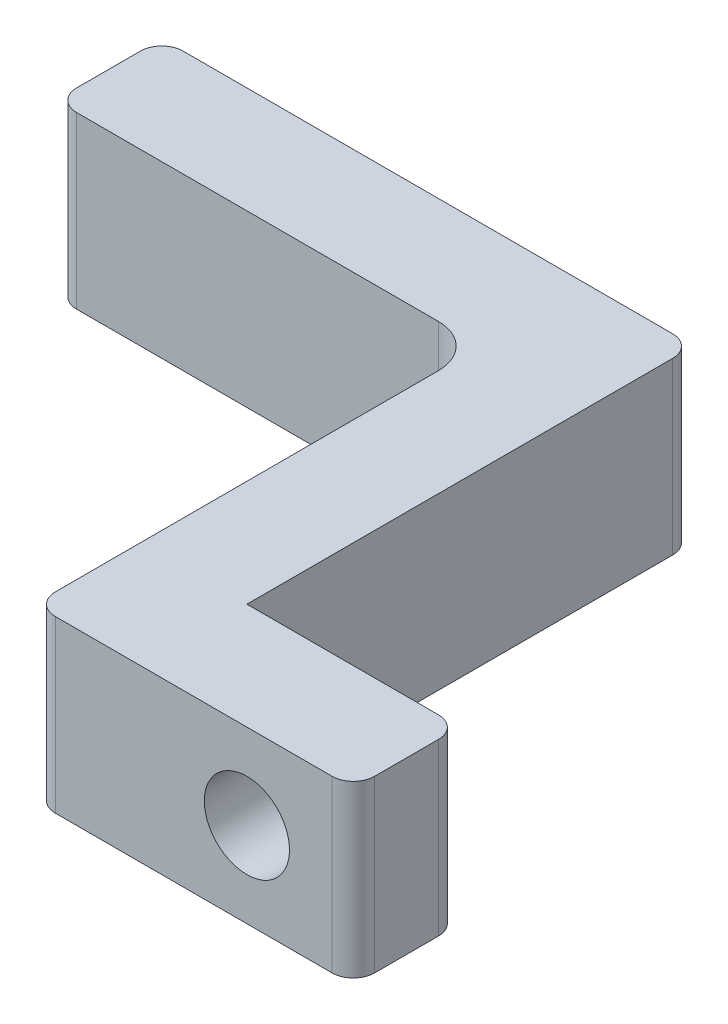
ISO-10303-21;
HEADER;
FILE_DESCRIPTION(('STEP AP214'),'2;1');
FILE_NAME('part.step','',(''),(''),'','','');
FILE_SCHEMA(('AUTOMOTIVE_DESIGN { 1 0 10303 214 1 1 1 1 }'));
ENDSEC;
DATA;
#1=APPLICATION_CONTEXT('core data for automotive mechanical design processes');
#2=APPLICATION_PROTOCOL_DEFINITION('international standard','automotive_design',2000,#1);
#3=PRODUCT_CONTEXT('',#1,'mechanical');
#4=PRODUCT('Part','Part','',(#3));
#5=PRODUCT_RELATED_PRODUCT_CATEGORY('part','',(#4));
#6=PRODUCT_DEFINITION_FORMATION('','',#4);
#7=PRODUCT_DEFINITION_CONTEXT('part definition',#1,'design');
#8=PRODUCT_DEFINITION('design','',#6,#7);
#9=PRODUCT_DEFINITION_SHAPE('','',#8);
#10=(LENGTH_UNIT() NAMED_UNIT(*) SI_UNIT(.MILLI.,.METRE.));
#11=(NAMED_UNIT(*) PLANE_ANGLE_UNIT() SI_UNIT($,.RADIAN.));
#12=(NAMED_UNIT(*) SI_UNIT($,.STERADIAN.) SOLID_ANGLE_UNIT());
#13=UNCERTAINTY_MEASURE_WITH_UNIT(LENGTH_MEASURE(1.E-05),#10,'distance_accuracy_value','');
#14=(GEOMETRIC_REPRESENTATION_CONTEXT(3) GLOBAL_UNCERTAINTY_ASSIGNED_CONTEXT((#13)) GLOBAL_UNIT_ASSIGNED_CONTEXT((#10,
#11,#12)) REPRESENTATION_CONTEXT('',''));
#15=CARTESIAN_POINT('',(0.,0.,0.));
#16=DIRECTION('',(0.,0.,1.));
#17=DIRECTION('',(1.,0.,0.));
#18=AXIS2_PLACEMENT_3D('',#15,#16,#17);
#19=CARTESIAN_POINT('',(0.,8.,0.));
#20=DIRECTION('',(0.,0.,1.));
#21=DIRECTION('',(1.,0.,0.));
#22=AXIS2_PLACEMENT_3D('',#19,#20,#21);
#23=PLANE('',#22);
#24=DIRECTION('',(-1.,0.,0.));
#25=VECTOR('',#24,1.);
#26=CARTESIAN_POINT('',(0.,8.,0.));
#27=LINE('',#26,#25);
#28=CARTESIAN_POINT('',(-2.,8.,0.));
#29=VERTEX_POINT('',#28);
#30=CARTESIAN_POINT('',(-19.,8.,0.));
#31=VERTEX_POINT('',#30);
#32=EDGE_CURVE('E155',#29,#31,#27,.T.);
#33=ORIENTED_EDGE('',*,*,#32,.T.);
#34=DIRECTION('',(0.,-1.,0.));
#35=VECTOR('',#34,1.);
#36=CARTESIAN_POINT('',(-19.,8.,0.));
#37=LINE('',#36,#35);
#38=CARTESIAN_POINT('',(-19.,0.,0.));
#39=VERTEX_POINT('',#38);
#40=EDGE_CURVE('E256',#31,#39,#37,.T.);
#41=ORIENTED_EDGE('',*,*,#40,.T.);
#42=DIRECTION('',(-1.,0.,0.));
#43=VECTOR('',#42,1.);
#44=CARTESIAN_POINT('',(0.,0.,0.));
#45=LINE('',#44,#43);
#46=CARTESIAN_POINT('',(-2.,0.,0.));
#47=VERTEX_POINT('',#46);
#48=EDGE_CURVE('E158',#47,#39,#45,.T.);
#49=ORIENTED_EDGE('',*,*,#48,.F.);
#50=DIRECTION('',(0.,-1.,0.));
#51=VECTOR('',#50,1.);
#52=CARTESIAN_POINT('',(-2.,8.,0.));
#53=LINE('',#52,#51);
#54=EDGE_CURVE('E151',#29,#47,#53,.T.);
#55=ORIENTED_EDGE('',*,*,#54,.F.);
#56=EDGE_LOOP('',(#33,#41,#49,#55));
#57=FACE_BOUND('',#56,.T.);
#58=ADVANCED_FACE('F43',(#57),#23,.T.);
#59=CARTESIAN_POINT('',(-2.,8.,2.));
#60=DIRECTION('',(0.,-1.,0.));
#61=DIRECTION('',(0.,0.,-1.));
#62=AXIS2_PLACEMENT_3D('',#59,#60,#61);
#63=CYLINDRICAL_SURFACE('',#62,2.);
#64=CARTESIAN_POINT('',(-2.,0.,2.));
#65=DIRECTION('',(0.,1.,0.));
#66=DIRECTION('',(0.,0.,1.));
#67=AXIS2_PLACEMENT_3D('',#64,#65,#66);
#68=CIRCLE('',#67,2.);
#69=CARTESIAN_POINT('',(0.,0.,2.));
#70=VERTEX_POINT('',#69);
#71=EDGE_CURVE('E203',#47,#70,#68,.F.);
#72=ORIENTED_EDGE('',*,*,#71,.T.);
#73=DIRECTION('',(0.,-1.,0.));
#74=VECTOR('',#73,1.);
#75=CARTESIAN_POINT('',(0.,8.,2.));
#76=LINE('',#75,#74);
#77=CARTESIAN_POINT('',(0.,8.,2.));
#78=VERTEX_POINT('',#77);
#79=EDGE_CURVE('E162',#78,#70,#76,.T.);
#80=ORIENTED_EDGE('',*,*,#79,.F.);
#81=CARTESIAN_POINT('',(-2.,8.,2.));
#82=DIRECTION('',(0.,1.,0.));
#83=DIRECTION('',(0.,0.,1.));
#84=AXIS2_PLACEMENT_3D('',#81,#82,#83);
#85=CIRCLE('',#84,2.);
#86=EDGE_CURVE('E165',#29,#78,#85,.F.);
#87=ORIENTED_EDGE('',*,*,#86,.F.);
#88=ORIENTED_EDGE('',*,*,#54,.T.);
#89=EDGE_LOOP('',(#72,#80,#87,#88));
#90=FACE_BOUND('',#89,.T.);
#91=ADVANCED_FACE('F166',(#90),#63,.F.);
#92=CARTESIAN_POINT('',(0.,8.,0.));
#93=DIRECTION('',(1.,0.,0.));
#94=DIRECTION('',(0.,0.,-1.));
#95=AXIS2_PLACEMENT_3D('',#92,#93,#94);
#96=PLANE('',#95);
#97=DIRECTION('',(0.,0.,1.));
#98=VECTOR('',#97,1.);
#99=CARTESIAN_POINT('',(0.,0.,0.));
#100=LINE('',#99,#98);
#101=CARTESIAN_POINT('',(0.,0.,20.));
#102=VERTEX_POINT('',#101);
#103=EDGE_CURVE('E206',#70,#102,#100,.T.);
#104=ORIENTED_EDGE('',*,*,#103,.T.);
#105=DIRECTION('',(0.,-1.,0.));
#106=VECTOR('',#105,1.);
#107=CARTESIAN_POINT('',(0.,8.,20.));
#108=LINE('',#107,#106);
#109=CARTESIAN_POINT('',(0.,8.,20.));
#110=VERTEX_POINT('',#109);
#111=EDGE_CURVE('E263',#102,#110,#108,.F.);
#112=ORIENTED_EDGE('',*,*,#111,.T.);
#113=DIRECTION('',(0.,0.,1.));
#114=VECTOR('',#113,1.);
#115=CARTESIAN_POINT('',(0.,8.,0.));
#116=LINE('',#115,#114);
#117=EDGE_CURVE('E170',#78,#110,#116,.T.);
#118=ORIENTED_EDGE('',*,*,#117,.F.);
#119=ORIENTED_EDGE('',*,*,#79,.T.);
#120=EDGE_LOOP('',(#104,#112,#118,#119));
#121=FACE_BOUND('',#120,.T.);
#122=ADVANCED_FACE('F300',(#121),#96,.F.);
#123=CARTESIAN_POINT('',(0.,8.,21.));
#124=DIRECTION('',(0.,0.,-1.));
#125=DIRECTION('',(-1.,0.,0.));
#126=AXIS2_PLACEMENT_3D('',#123,#124,#125);
#127=PLANE('',#126);
#128=CARTESIAN_POINT('',(10.,4.,21.));
#129=DIRECTION('',(0.,0.,-1.));
#130=DIRECTION('',(-1.,0.,0.));
#131=AXIS2_PLACEMENT_3D('',#128,#129,#130);
#132=CIRCLE('',#131,2.);
#133=CARTESIAN_POINT('',(8.,4.,21.));
#134=VERTEX_POINT('',#133);
#135=EDGE_CURVE('E204',#134,#134,#132,.T.);
#136=ORIENTED_EDGE('',*,*,#135,.T.);
#137=EDGE_LOOP('',(#136));
#138=FACE_BOUND('',#137,.T.);
#139=DIRECTION('',(1.,0.,0.));
#140=VECTOR('',#139,1.);
#141=CARTESIAN_POINT('',(0.,8.,21.));
#142=LINE('',#141,#140);
#143=CARTESIAN_POINT('',(1.,8.,21.));
#144=VERTEX_POINT('',#143);
#145=CARTESIAN_POINT('',(14.,8.,21.));
#146=VERTEX_POINT('',#145);
#147=EDGE_CURVE('E187',#144,#146,#142,.T.);
#148=ORIENTED_EDGE('',*,*,#147,.F.);
#149=DIRECTION('',(0.,-1.,0.));
#150=VECTOR('',#149,1.);
#151=CARTESIAN_POINT('',(1.,8.,21.));
#152=LINE('',#151,#150);
#153=CARTESIAN_POINT('',(1.,0.,21.));
#154=VERTEX_POINT('',#153);
#155=EDGE_CURVE('E260',#144,#154,#152,.T.);
#156=ORIENTED_EDGE('',*,*,#155,.T.);
#157=DIRECTION('',(1.,0.,0.));
#158=VECTOR('',#157,1.);
#159=CARTESIAN_POINT('',(0.,0.,21.));
#160=LINE('',#159,#158);
#161=CARTESIAN_POINT('',(14.,0.,21.));
#162=VERTEX_POINT('',#161);
#163=EDGE_CURVE('E209',#154,#162,#160,.T.);
#164=ORIENTED_EDGE('',*,*,#163,.T.);
#165=DIRECTION('',(0.,-1.,0.));
#166=VECTOR('',#165,1.);
#167=CARTESIAN_POINT('',(14.,8.,21.));
#168=LINE('',#167,#166);
#169=EDGE_CURVE('E258',#162,#146,#168,.F.);
#170=ORIENTED_EDGE('',*,*,#169,.T.);
#171=EDGE_LOOP('',(#148,#156,#164,#170));
#172=FACE_BOUND('',#171,.T.);
#173=ADVANCED_FACE('F309',(#138,#172),#127,.F.);
#174=CARTESIAN_POINT('',(15.,8.,0.));
#175=DIRECTION('',(-1.,0.,0.));
#176=DIRECTION('',(0.,0.,1.));
#177=AXIS2_PLACEMENT_3D('',#174,#175,#176);
#178=PLANE('',#177);
#179=DIRECTION('',(0.,0.,-1.));
#180=VECTOR('',#179,1.);
#181=CARTESIAN_POINT('',(15.,8.,0.));
#182=LINE('',#181,#180);
#183=CARTESIAN_POINT('',(15.,8.,20.));
#184=VERTEX_POINT('',#183);
#185=CARTESIAN_POINT('',(15.,8.,17.));
#186=VERTEX_POINT('',#185);
#187=EDGE_CURVE('E190',#184,#186,#182,.T.);
#188=ORIENTED_EDGE('',*,*,#187,.F.);
#189=DIRECTION('',(0.,-1.,0.));
#190=VECTOR('',#189,1.);
#191=CARTESIAN_POINT('',(15.,8.,20.));
#192=LINE('',#191,#190);
#193=CARTESIAN_POINT('',(15.,0.,20.));
#194=VERTEX_POINT('',#193);
#195=EDGE_CURVE('E267',#184,#194,#192,.T.);
#196=ORIENTED_EDGE('',*,*,#195,.T.);
#197=DIRECTION('',(0.,0.,-1.));
#198=VECTOR('',#197,1.);
#199=CARTESIAN_POINT('',(15.,0.,0.));
#200=LINE('',#199,#198);
#201=CARTESIAN_POINT('',(15.,0.,17.));
#202=VERTEX_POINT('',#201);
#203=EDGE_CURVE('E212',#194,#202,#200,.T.);
#204=ORIENTED_EDGE('',*,*,#203,.T.);
#205=DIRECTION('',(0.,-1.,0.));
#206=VECTOR('',#205,1.);
#207=CARTESIAN_POINT('',(15.,8.,17.));
#208=LINE('',#207,#206);
#209=EDGE_CURVE('E265',#202,#186,#208,.F.);
#210=ORIENTED_EDGE('',*,*,#209,.T.);
#211=EDGE_LOOP('',(#188,#196,#204,#210));
#212=FACE_BOUND('',#211,.T.);
#213=ADVANCED_FACE('F317',(#212),#178,.F.);
#214=CARTESIAN_POINT('',(0.,8.,16.));
#215=DIRECTION('',(0.,0.,-1.));
#216=DIRECTION('',(-1.,0.,0.));
#217=AXIS2_PLACEMENT_3D('',#214,#215,#216);
#218=PLANE('',#217);
#219=CARTESIAN_POINT('',(10.,4.,16.));
#220=DIRECTION('',(0.,0.,-1.));
#221=DIRECTION('',(-1.,0.,0.));
#222=AXIS2_PLACEMENT_3D('',#219,#220,#221);
#223=CIRCLE('',#222,2.);
#224=CARTESIAN_POINT('',(8.,4.,16.));
#225=VERTEX_POINT('',#224);
#226=EDGE_CURVE('E183',#225,#225,#223,.T.);
#227=ORIENTED_EDGE('',*,*,#226,.F.);
#228=EDGE_LOOP('',(#227));
#229=FACE_BOUND('',#228,.T.);
#230=DIRECTION('',(1.,0.,0.));
#231=VECTOR('',#230,1.);
#232=CARTESIAN_POINT('',(0.,8.,16.));
#233=LINE('',#232,#231);
#234=CARTESIAN_POINT('',(5.,8.,16.));
#235=VERTEX_POINT('',#234);
#236=CARTESIAN_POINT('',(14.,8.,16.));
#237=VERTEX_POINT('',#236);
#238=EDGE_CURVE('E192',#235,#237,#233,.T.);
#239=ORIENTED_EDGE('',*,*,#238,.T.);
#240=DIRECTION('',(0.,-1.,0.));
#241=VECTOR('',#240,1.);
#242=CARTESIAN_POINT('',(14.,0.,16.));
#243=LINE('',#242,#241);
#244=CARTESIAN_POINT('',(14.,0.,16.));
#245=VERTEX_POINT('',#244);
#246=EDGE_CURVE('E51',#237,#245,#243,.T.);
#247=ORIENTED_EDGE('',*,*,#246,.T.);
#248=DIRECTION('',(1.,0.,0.));
#249=VECTOR('',#248,1.);
#250=CARTESIAN_POINT('',(0.,0.,16.));
#251=LINE('',#250,#249);
#252=CARTESIAN_POINT('',(5.,0.,16.));
#253=VERTEX_POINT('',#252);
#254=EDGE_CURVE('E215',#253,#245,#251,.T.);
#255=ORIENTED_EDGE('',*,*,#254,.F.);
#256=DIRECTION('',(0.,-1.,0.));
#257=VECTOR('',#256,1.);
#258=CARTESIAN_POINT('',(5.,8.,16.));
#259=LINE('',#258,#257);
#260=EDGE_CURVE('E201',#235,#253,#259,.T.);
#261=ORIENTED_EDGE('',*,*,#260,.F.);
#262=EDGE_LOOP('',(#239,#247,#255,#261));
#263=FACE_BOUND('',#262,.T.);
#264=ADVANCED_FACE('F273',(#229,#263),#218,.T.);
#265=CARTESIAN_POINT('',(5.,8.,0.));
#266=DIRECTION('',(1.,0.,0.));
#267=DIRECTION('',(0.,0.,-1.));
#268=AXIS2_PLACEMENT_3D('',#265,#266,#267);
#269=PLANE('',#268);
#270=DIRECTION('',(0.,0.,1.));
#271=VECTOR('',#270,1.);
#272=CARTESIAN_POINT('',(5.,0.,0.));
#273=LINE('',#272,#271);
#274=CARTESIAN_POINT('',(5.,0.,-4.));
#275=VERTEX_POINT('',#274);
#276=EDGE_CURVE('E218',#275,#253,#273,.T.);
#277=ORIENTED_EDGE('',*,*,#276,.F.);
#278=DIRECTION('',(0.,-1.,0.));
#279=VECTOR('',#278,1.);
#280=CARTESIAN_POINT('',(5.,8.,-4.));
#281=LINE('',#280,#279);
#282=CARTESIAN_POINT('',(5.,8.,-4.));
#283=VERTEX_POINT('',#282);
#284=EDGE_CURVE('E11',#275,#283,#281,.F.);
#285=ORIENTED_EDGE('',*,*,#284,.T.);
#286=DIRECTION('',(0.,0.,1.));
#287=VECTOR('',#286,1.);
#288=CARTESIAN_POINT('',(5.,8.,0.));
#289=LINE('',#288,#287);
#290=EDGE_CURVE('E194',#283,#235,#289,.T.);
#291=ORIENTED_EDGE('',*,*,#290,.T.);
#292=ORIENTED_EDGE('',*,*,#260,.T.);
#293=EDGE_LOOP('',(#277,#285,#291,#292));
#294=FACE_BOUND('',#293,.T.);
#295=ADVANCED_FACE('F280',(#294),#269,.T.);
#296=CARTESIAN_POINT('',(0.,8.,-5.));
#297=DIRECTION('',(0.,0.,1.));
#298=DIRECTION('',(1.,0.,0.));
#299=AXIS2_PLACEMENT_3D('',#296,#297,#298);
#300=PLANE('',#299);
#301=DIRECTION('',(-1.,0.,0.));
#302=VECTOR('',#301,1.);
#303=CARTESIAN_POINT('',(0.,0.,-5.));
#304=LINE('',#303,#302);
#305=CARTESIAN_POINT('',(4.,0.,-5.));
#306=VERTEX_POINT('',#305);
#307=CARTESIAN_POINT('',(-19.,0.,-5.));
#308=VERTEX_POINT('',#307);
#309=EDGE_CURVE('E180',#306,#308,#304,.T.);
#310=ORIENTED_EDGE('',*,*,#309,.T.);
#311=DIRECTION('',(0.,-1.,0.));
#312=VECTOR('',#311,1.);
#313=CARTESIAN_POINT('',(-19.,8.,-5.));
#314=LINE('',#313,#312);
#315=CARTESIAN_POINT('',(-19.,8.,-5.));
#316=VERTEX_POINT('',#315);
#317=EDGE_CURVE('E244',#308,#316,#314,.F.);
#318=ORIENTED_EDGE('',*,*,#317,.T.);
#319=DIRECTION('',(-1.,0.,0.));
#320=VECTOR('',#319,1.);
#321=CARTESIAN_POINT('',(0.,8.,-5.));
#322=LINE('',#321,#320);
#323=CARTESIAN_POINT('',(4.,8.,-5.));
#324=VERTEX_POINT('',#323);
#325=EDGE_CURVE('E196',#324,#316,#322,.T.);
#326=ORIENTED_EDGE('',*,*,#325,.F.);
#327=DIRECTION('',(0.,-1.,0.));
#328=VECTOR('',#327,1.);
#329=CARTESIAN_POINT('',(4.,0.,-5.));
#330=LINE('',#329,#328);
#331=EDGE_CURVE('E241',#324,#306,#330,.T.);
#332=ORIENTED_EDGE('',*,*,#331,.T.);
#333=EDGE_LOOP('',(#310,#318,#326,#332));
#334=FACE_BOUND('',#333,.T.);
#335=ADVANCED_FACE('F286',(#334),#300,.F.);
#336=CARTESIAN_POINT('',(-20.,8.,0.));
#337=DIRECTION('',(-1.,0.,0.));
#338=DIRECTION('',(0.,0.,1.));
#339=AXIS2_PLACEMENT_3D('',#336,#337,#338);
#340=PLANE('',#339);
#341=DIRECTION('',(0.,0.,-1.));
#342=VECTOR('',#341,1.);
#343=CARTESIAN_POINT('',(-20.,8.,0.));
#344=LINE('',#343,#342);
#345=CARTESIAN_POINT('',(-20.,8.,-0.999999999999997));
#346=VERTEX_POINT('',#345);
#347=CARTESIAN_POINT('',(-20.,8.,-4.));
#348=VERTEX_POINT('',#347);
#349=EDGE_CURVE('E198',#346,#348,#344,.T.);
#350=ORIENTED_EDGE('',*,*,#349,.T.);
#351=DIRECTION('',(0.,-1.,0.));
#352=VECTOR('',#351,1.);
#353=CARTESIAN_POINT('',(-20.,0.,-4.));
#354=LINE('',#353,#352);
#355=CARTESIAN_POINT('',(-20.,0.,-4.));
#356=VERTEX_POINT('',#355);
#357=EDGE_CURVE('E226',#348,#356,#354,.T.);
#358=ORIENTED_EDGE('',*,*,#357,.T.);
#359=DIRECTION('',(0.,0.,-1.));
#360=VECTOR('',#359,1.);
#361=CARTESIAN_POINT('',(-20.,0.,0.));
#362=LINE('',#361,#360);
#363=CARTESIAN_POINT('',(-20.,0.,-0.999999999999997));
#364=VERTEX_POINT('',#363);
#365=EDGE_CURVE('E177',#364,#356,#362,.T.);
#366=ORIENTED_EDGE('',*,*,#365,.F.);
#367=DIRECTION('',(0.,-1.,0.));
#368=VECTOR('',#367,1.);
#369=CARTESIAN_POINT('',(-20.,8.,-0.999999999999997));
#370=LINE('',#369,#368);
#371=EDGE_CURVE('E161',#364,#346,#370,.F.);
#372=ORIENTED_EDGE('',*,*,#371,.T.);
#373=EDGE_LOOP('',(#350,#358,#366,#372));
#374=FACE_BOUND('',#373,.T.);
#375=ADVANCED_FACE('F294',(#374),#340,.T.);
#376=CARTESIAN_POINT('',(0.,8.,0.));
#377=DIRECTION('',(0.,1.,0.));
#378=DIRECTION('',(0.,0.,1.));
#379=AXIS2_PLACEMENT_3D('',#376,#377,#378);
#380=PLANE('',#379);
#381=ORIENTED_EDGE('',*,*,#325,.T.);
#382=CARTESIAN_POINT('',(-19.,8.,-4.));
#383=DIRECTION('',(0.,1.,0.));
#384=DIRECTION('',(0.,0.,1.));
#385=AXIS2_PLACEMENT_3D('',#382,#383,#384);
#386=CIRCLE('',#385,1.);
#387=EDGE_CURVE('E254',#316,#348,#386,.T.);
#388=ORIENTED_EDGE('',*,*,#387,.T.);
#389=ORIENTED_EDGE('',*,*,#349,.F.);
#390=CARTESIAN_POINT('',(-19.,8.,-0.999999999999997));
#391=DIRECTION('',(0.,1.,0.));
#392=DIRECTION('',(0.,0.,1.));
#393=AXIS2_PLACEMENT_3D('',#390,#391,#392);
#394=CIRCLE('',#393,1.);
#395=EDGE_CURVE('E176',#346,#31,#394,.T.);
#396=ORIENTED_EDGE('',*,*,#395,.T.);
#397=ORIENTED_EDGE('',*,*,#32,.F.);
#398=ORIENTED_EDGE('',*,*,#86,.T.);
#399=ORIENTED_EDGE('',*,*,#117,.T.);
#400=CARTESIAN_POINT('',(1.,8.,20.));
#401=DIRECTION('',(0.,1.,0.));
#402=DIRECTION('',(0.,0.,1.));
#403=AXIS2_PLACEMENT_3D('',#400,#401,#402);
#404=CIRCLE('',#403,1.);
#405=EDGE_CURVE('E251',#110,#144,#404,.T.);
#406=ORIENTED_EDGE('',*,*,#405,.T.);
#407=ORIENTED_EDGE('',*,*,#147,.T.);
#408=CARTESIAN_POINT('',(14.,8.,20.));
#409=DIRECTION('',(0.,1.,0.));
#410=DIRECTION('',(0.,0.,1.));
#411=AXIS2_PLACEMENT_3D('',#408,#409,#410);
#412=CIRCLE('',#411,1.);
#413=EDGE_CURVE('E249',#146,#184,#412,.T.);
#414=ORIENTED_EDGE('',*,*,#413,.T.);
#415=ORIENTED_EDGE('',*,*,#187,.T.);
#416=CARTESIAN_POINT('',(14.,8.,17.));
#417=DIRECTION('',(0.,1.,0.));
#418=DIRECTION('',(0.,0.,1.));
#419=AXIS2_PLACEMENT_3D('',#416,#417,#418);
#420=CIRCLE('',#419,1.);
#421=EDGE_CURVE('E64',#186,#237,#420,.T.);
#422=ORIENTED_EDGE('',*,*,#421,.T.);
#423=ORIENTED_EDGE('',*,*,#238,.F.);
#424=ORIENTED_EDGE('',*,*,#290,.F.);
#425=CARTESIAN_POINT('',(4.,8.,-4.));
#426=DIRECTION('',(0.,1.,0.));
#427=DIRECTION('',(0.,0.,1.));
#428=AXIS2_PLACEMENT_3D('',#425,#426,#427);
#429=CIRCLE('',#428,1.);
#430=EDGE_CURVE('E246',#283,#324,#429,.T.);
#431=ORIENTED_EDGE('',*,*,#430,.T.);
#432=EDGE_LOOP('',(#381,#388,#389,#396,#397,#398,#399,#406,#407,#414,#415,#422,#423,#424,#431));
#433=FACE_BOUND('',#432,.T.);
#434=ADVANCED_FACE('F173',(#433),#380,.T.);
#435=CARTESIAN_POINT('',(0.,0.,0.));
#436=DIRECTION('',(0.,1.,0.));
#437=DIRECTION('',(0.,0.,1.));
#438=AXIS2_PLACEMENT_3D('',#435,#436,#437);
#439=PLANE('',#438);
#440=ORIENTED_EDGE('',*,*,#365,.T.);
#441=CARTESIAN_POINT('',(-19.,0.,-4.));
#442=DIRECTION('',(0.,1.,0.));
#443=DIRECTION('',(0.,0.,1.));
#444=AXIS2_PLACEMENT_3D('',#441,#442,#443);
#445=CIRCLE('',#444,1.);
#446=EDGE_CURVE('E239',#356,#308,#445,.F.);
#447=ORIENTED_EDGE('',*,*,#446,.T.);
#448=ORIENTED_EDGE('',*,*,#309,.F.);
#449=CARTESIAN_POINT('',(4.,0.,-4.));
#450=DIRECTION('',(0.,1.,0.));
#451=DIRECTION('',(0.,0.,1.));
#452=AXIS2_PLACEMENT_3D('',#449,#450,#451);
#453=CIRCLE('',#452,1.);
#454=EDGE_CURVE('E229',#306,#275,#453,.F.);
#455=ORIENTED_EDGE('',*,*,#454,.T.);
#456=ORIENTED_EDGE('',*,*,#276,.T.);
#457=ORIENTED_EDGE('',*,*,#254,.T.);
#458=CARTESIAN_POINT('',(14.,0.,17.));
#459=DIRECTION('',(0.,1.,0.));
#460=DIRECTION('',(0.,0.,1.));
#461=AXIS2_PLACEMENT_3D('',#458,#459,#460);
#462=CIRCLE('',#461,1.);
#463=EDGE_CURVE('E231',#245,#202,#462,.F.);
#464=ORIENTED_EDGE('',*,*,#463,.T.);
#465=ORIENTED_EDGE('',*,*,#203,.F.);
#466=CARTESIAN_POINT('',(14.,0.,20.));
#467=DIRECTION('',(0.,1.,0.));
#468=DIRECTION('',(0.,0.,1.));
#469=AXIS2_PLACEMENT_3D('',#466,#467,#468);
#470=CIRCLE('',#469,1.);
#471=EDGE_CURVE('E233',#194,#162,#470,.F.);
#472=ORIENTED_EDGE('',*,*,#471,.T.);
#473=ORIENTED_EDGE('',*,*,#163,.F.);
#474=CARTESIAN_POINT('',(1.,0.,20.));
#475=DIRECTION('',(0.,1.,0.));
#476=DIRECTION('',(0.,0.,1.));
#477=AXIS2_PLACEMENT_3D('',#474,#475,#476);
#478=CIRCLE('',#477,1.);
#479=EDGE_CURVE('E235',#154,#102,#478,.F.);
#480=ORIENTED_EDGE('',*,*,#479,.T.);
#481=ORIENTED_EDGE('',*,*,#103,.F.);
#482=ORIENTED_EDGE('',*,*,#71,.F.);
#483=ORIENTED_EDGE('',*,*,#48,.T.);
#484=CARTESIAN_POINT('',(-19.,0.,-0.999999999999997));
#485=DIRECTION('',(0.,1.,0.));
#486=DIRECTION('',(0.,0.,1.));
#487=AXIS2_PLACEMENT_3D('',#484,#485,#486);
#488=CIRCLE('',#487,1.);
#489=EDGE_CURVE('E237',#39,#364,#488,.F.);
#490=ORIENTED_EDGE('',*,*,#489,.T.);
#491=EDGE_LOOP('',(#440,#447,#448,#455,#456,#457,#464,#465,#472,#473,#480,#481,#482,#483,#490));
#492=FACE_BOUND('',#491,.T.);
#493=ADVANCED_FACE('F277',(#492),#439,.F.);
#494=CARTESIAN_POINT('',(10.,4.,21.));
#495=DIRECTION('',(0.,0.,-1.));
#496=DIRECTION('',(-1.,0.,0.));
#497=AXIS2_PLACEMENT_3D('',#494,#495,#496);
#498=CYLINDRICAL_SURFACE('',#497,2.);
#499=ORIENTED_EDGE('',*,*,#135,.F.);
#500=EDGE_LOOP('',(#499));
#501=FACE_BOUND('',#500,.T.);
#502=ORIENTED_EDGE('',*,*,#226,.T.);
#503=EDGE_LOOP('',(#502));
#504=FACE_BOUND('',#503,.T.);
#505=ADVANCED_FACE('F338',(#501,#504),#498,.F.);
#506=CARTESIAN_POINT('',(-19.,8.,-4.));
#507=DIRECTION('',(0.,1.,0.));
#508=DIRECTION('',(0.,0.,1.));
#509=AXIS2_PLACEMENT_3D('',#506,#507,#508);
#510=CYLINDRICAL_SURFACE('',#509,1.);
#511=ORIENTED_EDGE('',*,*,#387,.F.);
#512=ORIENTED_EDGE('',*,*,#317,.F.);
#513=ORIENTED_EDGE('',*,*,#446,.F.);
#514=ORIENTED_EDGE('',*,*,#357,.F.);
#515=EDGE_LOOP('',(#511,#512,#513,#514));
#516=FACE_BOUND('',#515,.T.);
#517=ADVANCED_FACE('F292',(#516),#510,.T.);
#518=CARTESIAN_POINT('',(-19.,8.,-0.999999999999997));
#519=DIRECTION('',(0.,-1.,0.));
#520=DIRECTION('',(0.,0.,-1.));
#521=AXIS2_PLACEMENT_3D('',#518,#519,#520);
#522=CYLINDRICAL_SURFACE('',#521,1.);
#523=ORIENTED_EDGE('',*,*,#395,.F.);
#524=ORIENTED_EDGE('',*,*,#371,.F.);
#525=ORIENTED_EDGE('',*,*,#489,.F.);
#526=ORIENTED_EDGE('',*,*,#40,.F.);
#527=EDGE_LOOP('',(#523,#524,#525,#526));
#528=FACE_BOUND('',#527,.T.);
#529=ADVANCED_FACE('F297',(#528),#522,.T.);
#530=CARTESIAN_POINT('',(1.,8.,20.));
#531=DIRECTION('',(0.,-1.,0.));
#532=DIRECTION('',(0.,0.,-1.));
#533=AXIS2_PLACEMENT_3D('',#530,#531,#532);
#534=CYLINDRICAL_SURFACE('',#533,1.);
#535=ORIENTED_EDGE('',*,*,#405,.F.);
#536=ORIENTED_EDGE('',*,*,#111,.F.);
#537=ORIENTED_EDGE('',*,*,#479,.F.);
#538=ORIENTED_EDGE('',*,*,#155,.F.);
#539=EDGE_LOOP('',(#535,#536,#537,#538));
#540=FACE_BOUND('',#539,.T.);
#541=ADVANCED_FACE('F306',(#540),#534,.T.);
#542=CARTESIAN_POINT('',(14.,8.,20.));
#543=DIRECTION('',(0.,-1.,0.));
#544=DIRECTION('',(0.,0.,-1.));
#545=AXIS2_PLACEMENT_3D('',#542,#543,#544);
#546=CYLINDRICAL_SURFACE('',#545,1.);
#547=ORIENTED_EDGE('',*,*,#413,.F.);
#548=ORIENTED_EDGE('',*,*,#169,.F.);
#549=ORIENTED_EDGE('',*,*,#471,.F.);
#550=ORIENTED_EDGE('',*,*,#195,.F.);
#551=EDGE_LOOP('',(#547,#548,#549,#550));
#552=FACE_BOUND('',#551,.T.);
#553=ADVANCED_FACE('F314',(#552),#546,.T.);
#554=CARTESIAN_POINT('',(14.,8.,17.));
#555=DIRECTION('',(0.,1.,0.));
#556=DIRECTION('',(0.,0.,1.));
#557=AXIS2_PLACEMENT_3D('',#554,#555,#556);
#558=CYLINDRICAL_SURFACE('',#557,1.);
#559=ORIENTED_EDGE('',*,*,#421,.F.);
#560=ORIENTED_EDGE('',*,*,#209,.F.);
#561=ORIENTED_EDGE('',*,*,#463,.F.);
#562=ORIENTED_EDGE('',*,*,#246,.F.);
#563=EDGE_LOOP('',(#559,#560,#561,#562));
#564=FACE_BOUND('',#563,.T.);
#565=ADVANCED_FACE('F319',(#564),#558,.T.);
#566=CARTESIAN_POINT('',(4.,8.,-4.));
#567=DIRECTION('',(0.,1.,0.));
#568=DIRECTION('',(0.,0.,1.));
#569=AXIS2_PLACEMENT_3D('',#566,#567,#568);
#570=CYLINDRICAL_SURFACE('',#569,1.);
#571=ORIENTED_EDGE('',*,*,#430,.F.);
#572=ORIENTED_EDGE('',*,*,#284,.F.);
#573=ORIENTED_EDGE('',*,*,#454,.F.);
#574=ORIENTED_EDGE('',*,*,#331,.F.);
#575=EDGE_LOOP('',(#571,#572,#573,#574));
#576=FACE_BOUND('',#575,.T.);
#577=ADVANCED_FACE('F45',(#576),#570,.T.);
#578=CLOSED_SHELL('',(#58,#91,#122,#173,#213,#264,#295,#335,#375,#434,#493,#505,#517,#529,#541,
#553,#565,#577));
#579=MANIFOLD_SOLID_BREP('B2',#578);
#580=ADVANCED_BREP_SHAPE_REPRESENTATION('',(#18,#579),#14);
#581=SHAPE_DEFINITION_REPRESENTATION(#9,#580);
ENDSEC;
END-ISO-10303-21;
